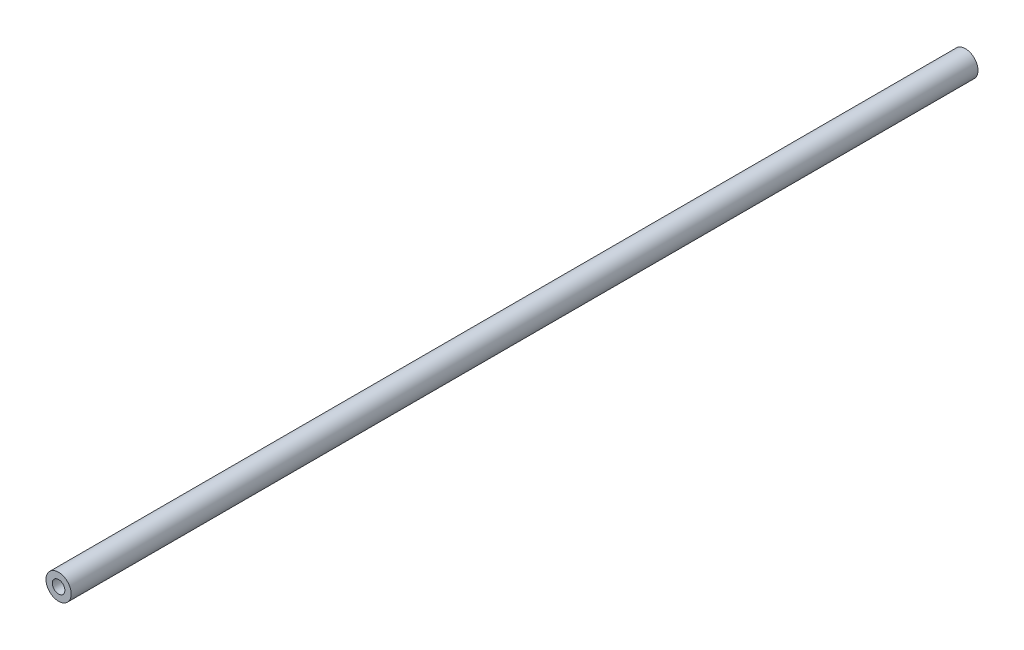
ISO-10303-21;
HEADER;
FILE_DESCRIPTION(('STEP AP214'),'2;1');
FILE_NAME('part.step','',(''),(''),'','','');
FILE_SCHEMA(('AUTOMOTIVE_DESIGN { 1 0 10303 214 1 1 1 1 }'));
ENDSEC;
DATA;
#1=APPLICATION_CONTEXT('core data for automotive mechanical design processes');
#2=APPLICATION_PROTOCOL_DEFINITION('international standard','automotive_design',2000,#1);
#3=PRODUCT_CONTEXT('',#1,'mechanical');
#4=PRODUCT('Part','Part','',(#3));
#5=PRODUCT_RELATED_PRODUCT_CATEGORY('part','',(#4));
#6=PRODUCT_DEFINITION_FORMATION('','',#4);
#7=PRODUCT_DEFINITION_CONTEXT('part definition',#1,'design');
#8=PRODUCT_DEFINITION('design','',#6,#7);
#9=PRODUCT_DEFINITION_SHAPE('','',#8);
#10=(LENGTH_UNIT() NAMED_UNIT(*) SI_UNIT(.MILLI.,.METRE.));
#11=(NAMED_UNIT(*) PLANE_ANGLE_UNIT() SI_UNIT($,.RADIAN.));
#12=(NAMED_UNIT(*) SI_UNIT($,.STERADIAN.) SOLID_ANGLE_UNIT());
#13=UNCERTAINTY_MEASURE_WITH_UNIT(LENGTH_MEASURE(1.E-05),#10,'distance_accuracy_value','');
#14=(GEOMETRIC_REPRESENTATION_CONTEXT(3) GLOBAL_UNCERTAINTY_ASSIGNED_CONTEXT((#13)) GLOBAL_UNIT_ASSIGNED_CONTEXT((#10,
#11,#12)) REPRESENTATION_CONTEXT('',''));
#15=CARTESIAN_POINT('',(0.,0.,0.));
#16=DIRECTION('',(0.,0.,1.));
#17=DIRECTION('',(1.,0.,0.));
#18=AXIS2_PLACEMENT_3D('',#15,#16,#17);
#19=CARTESIAN_POINT('',(0.,0.,114.3));
#20=DIRECTION('',(0.,0.,1.));
#21=DIRECTION('',(1.,0.,0.));
#22=AXIS2_PLACEMENT_3D('',#19,#20,#21);
#23=PLANE('',#22);
#24=CARTESIAN_POINT('',(0.,0.,114.3));
#25=DIRECTION('',(0.,0.,1.));
#26=DIRECTION('',(1.,0.,0.));
#27=AXIS2_PLACEMENT_3D('',#24,#25,#26);
#28=CIRCLE('',#27,1.5875);
#29=CARTESIAN_POINT('',(1.5875,0.,114.3));
#30=VERTEX_POINT('',#29);
#31=EDGE_CURVE('E10',#30,#30,#28,.T.);
#32=ORIENTED_EDGE('',*,*,#31,.T.);
#33=EDGE_LOOP('',(#32));
#34=FACE_BOUND('',#33,.T.);
#35=CARTESIAN_POINT('',(0.,0.,114.3));
#36=DIRECTION('',(0.,0.,1.));
#37=DIRECTION('',(1.,0.,0.));
#38=AXIS2_PLACEMENT_3D('',#35,#36,#37);
#39=CIRCLE('',#38,0.79375);
#40=CARTESIAN_POINT('',(0.79375,0.,114.3));
#41=VERTEX_POINT('',#40);
#42=EDGE_CURVE('E58',#41,#41,#39,.T.);
#43=ORIENTED_EDGE('',*,*,#42,.F.);
#44=EDGE_LOOP('',(#43));
#45=FACE_BOUND('',#44,.T.);
#46=ADVANCED_FACE('F45',(#34,#45),#23,.T.);
#47=CARTESIAN_POINT('',(0.,0.,0.));
#48=DIRECTION('',(0.,0.,1.));
#49=DIRECTION('',(1.,0.,0.));
#50=AXIS2_PLACEMENT_3D('',#47,#48,#49);
#51=PLANE('',#50);
#52=CARTESIAN_POINT('',(0.,0.,0.));
#53=DIRECTION('',(0.,0.,1.));
#54=DIRECTION('',(1.,0.,0.));
#55=AXIS2_PLACEMENT_3D('',#52,#53,#54);
#56=CIRCLE('',#55,1.5875);
#57=CARTESIAN_POINT('',(1.5875,0.,0.));
#58=VERTEX_POINT('',#57);
#59=EDGE_CURVE('E49',#58,#58,#56,.T.);
#60=ORIENTED_EDGE('',*,*,#59,.F.);
#61=EDGE_LOOP('',(#60));
#62=FACE_BOUND('',#61,.T.);
#63=CARTESIAN_POINT('',(0.,0.,0.));
#64=DIRECTION('',(0.,0.,1.));
#65=DIRECTION('',(1.,0.,0.));
#66=AXIS2_PLACEMENT_3D('',#63,#64,#65);
#67=CIRCLE('',#66,0.79375);
#68=CARTESIAN_POINT('',(0.79375,0.,0.));
#69=VERTEX_POINT('',#68);
#70=EDGE_CURVE('E60',#69,#69,#67,.T.);
#71=ORIENTED_EDGE('',*,*,#70,.T.);
#72=EDGE_LOOP('',(#71));
#73=FACE_BOUND('',#72,.T.);
#74=ADVANCED_FACE('F72',(#62,#73),#51,.F.);
#75=CARTESIAN_POINT('',(0.,0.,114.3));
#76=DIRECTION('',(0.,0.,-1.));
#77=DIRECTION('',(-1.,0.,0.));
#78=AXIS2_PLACEMENT_3D('',#75,#76,#77);
#79=CYLINDRICAL_SURFACE('',#78,1.5875);
#80=ORIENTED_EDGE('',*,*,#31,.F.);
#81=EDGE_LOOP('',(#80));
#82=FACE_BOUND('',#81,.T.);
#83=ORIENTED_EDGE('',*,*,#59,.T.);
#84=EDGE_LOOP('',(#83));
#85=FACE_BOUND('',#84,.T.);
#86=ADVANCED_FACE('F47',(#82,#85),#79,.T.);
#87=CARTESIAN_POINT('',(0.,0.,114.3));
#88=DIRECTION('',(0.,0.,-1.));
#89=DIRECTION('',(-1.,0.,0.));
#90=AXIS2_PLACEMENT_3D('',#87,#88,#89);
#91=CYLINDRICAL_SURFACE('',#90,0.79375);
#92=ORIENTED_EDGE('',*,*,#42,.T.);
#93=EDGE_LOOP('',(#92));
#94=FACE_BOUND('',#93,.T.);
#95=ORIENTED_EDGE('',*,*,#70,.F.);
#96=EDGE_LOOP('',(#95));
#97=FACE_BOUND('',#96,.T.);
#98=ADVANCED_FACE('F68',(#94,#97),#91,.F.);
#99=CLOSED_SHELL('',(#46,#74,#86,#98));
#100=MANIFOLD_SOLID_BREP('B2',#99);
#101=ADVANCED_BREP_SHAPE_REPRESENTATION('',(#18,#100),#14);
#102=SHAPE_DEFINITION_REPRESENTATION(#9,#101);
ENDSEC;
END-ISO-10303-21;
